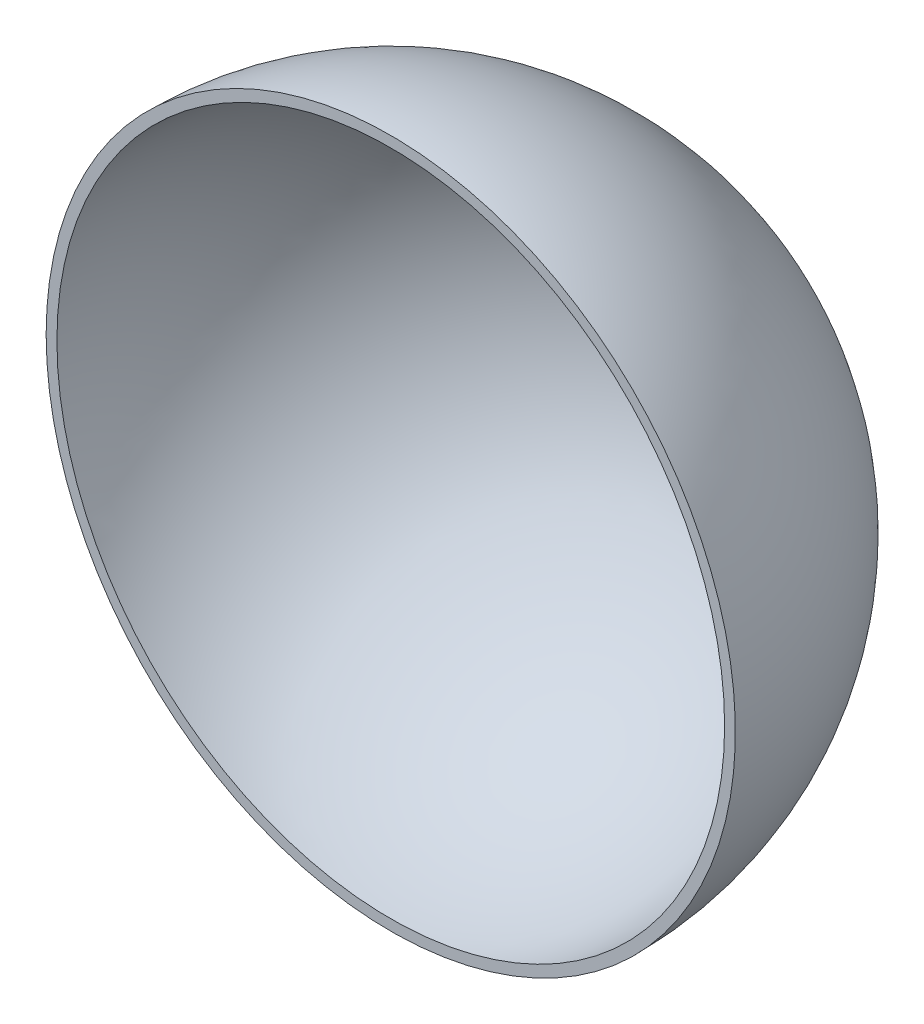
ISO-10303-21;
HEADER;
FILE_DESCRIPTION(('STEP AP214'),'2;1');
FILE_NAME('part.step','',(''),(''),'','','');
FILE_SCHEMA(('AUTOMOTIVE_DESIGN { 1 0 10303 214 1 1 1 1 }'));
ENDSEC;
DATA;
#1=APPLICATION_CONTEXT('core data for automotive mechanical design processes');
#2=APPLICATION_PROTOCOL_DEFINITION('international standard','automotive_design',2000,#1);
#3=PRODUCT_CONTEXT('',#1,'mechanical');
#4=PRODUCT('Part','Part','',(#3));
#5=PRODUCT_RELATED_PRODUCT_CATEGORY('part','',(#4));
#6=PRODUCT_DEFINITION_FORMATION('','',#4);
#7=PRODUCT_DEFINITION_CONTEXT('part definition',#1,'design');
#8=PRODUCT_DEFINITION('design','',#6,#7);
#9=PRODUCT_DEFINITION_SHAPE('','',#8);
#10=(LENGTH_UNIT() NAMED_UNIT(*) SI_UNIT(.MILLI.,.METRE.));
#11=(NAMED_UNIT(*) PLANE_ANGLE_UNIT() SI_UNIT($,.RADIAN.));
#12=(NAMED_UNIT(*) SI_UNIT($,.STERADIAN.) SOLID_ANGLE_UNIT());
#13=UNCERTAINTY_MEASURE_WITH_UNIT(LENGTH_MEASURE(1.E-05),#10,'distance_accuracy_value','');
#14=(GEOMETRIC_REPRESENTATION_CONTEXT(3) GLOBAL_UNCERTAINTY_ASSIGNED_CONTEXT((#13)) GLOBAL_UNIT_ASSIGNED_CONTEXT((#10,
#11,#12)) REPRESENTATION_CONTEXT('',''));
#15=CARTESIAN_POINT('',(0.,0.,0.));
#16=DIRECTION('',(0.,0.,1.));
#17=DIRECTION('',(1.,0.,0.));
#18=AXIS2_PLACEMENT_3D('',#15,#16,#17);
#19=CARTESIAN_POINT('',(0.,0.,0.));
#20=DIRECTION('',(0.,1.,0.));
#21=DIRECTION('',(-1.,0.,0.));
#22=AXIS2_PLACEMENT_3D('',#19,#20,#21);
#23=SPHERICAL_SURFACE('',#22,320.);
#24=CARTESIAN_POINT('',(0.,0.,0.));
#25=DIRECTION('',(0.,0.,-1.));
#26=DIRECTION('',(-1.,0.,0.));
#27=AXIS2_PLACEMENT_3D('',#24,#25,#26);
#28=SPHERICAL_SURFACE('',#27,320.);
#29=CARTESIAN_POINT('',(0.,0.,0.));
#30=DIRECTION('',(0.,0.,-1.));
#31=DIRECTION('',(-1.,0.,0.));
#32=AXIS2_PLACEMENT_3D('',#29,#30,#31);
#33=CIRCLE('',#32,320.);
#34=CARTESIAN_POINT('',(-320.,0.,-2.23454805685961E-12));
#35=VERTEX_POINT('',#34);
#36=EDGE_CURVE('E45',#35,#35,#33,.T.);
#37=ORIENTED_EDGE('',*,*,#36,.T.);
#38=EDGE_LOOP('',(#37));
#39=FACE_BOUND('',#38,.T.);
#40=ADVANCED_FACE('F37',(#39),#28,.T.);
#41=CARTESIAN_POINT('',(0.,0.,0.));
#42=DIRECTION('',(0.,1.,0.));
#43=DIRECTION('',(1.,0.,0.));
#44=AXIS2_PLACEMENT_3D('',#41,#42,#43);
#45=SPHERICAL_SURFACE('',#44,310.);
#46=CARTESIAN_POINT('',(0.,0.,0.));
#47=DIRECTION('',(0.,0.,1.));
#48=DIRECTION('',(-1.,0.,0.));
#49=AXIS2_PLACEMENT_3D('',#46,#47,#48);
#50=SPHERICAL_SURFACE('',#49,310.);
#51=CARTESIAN_POINT('',(0.,0.,0.));
#52=DIRECTION('',(0.,0.,1.));
#53=DIRECTION('',(-1.,0.,0.));
#54=AXIS2_PLACEMENT_3D('',#51,#52,#53);
#55=CIRCLE('',#54,310.);
#56=CARTESIAN_POINT('',(-310.,0.,-2.16471843008274E-12));
#57=VERTEX_POINT('',#56);
#58=EDGE_CURVE('E10',#57,#57,#55,.T.);
#59=ORIENTED_EDGE('',*,*,#58,.T.);
#60=EDGE_LOOP('',(#59));
#61=FACE_BOUND('',#60,.T.);
#62=ADVANCED_FACE('F39',(#61),#50,.F.);
#63=CARTESIAN_POINT('',(0.,0.,0.));
#64=DIRECTION('',(0.,0.,-1.));
#65=DIRECTION('',(-1.,0.,0.));
#66=AXIS2_PLACEMENT_3D('',#63,#64,#65);
#67=PLANE('',#66);
#68=ORIENTED_EDGE('',*,*,#58,.F.);
#69=EDGE_LOOP('',(#68));
#70=FACE_BOUND('',#69,.T.);
#71=ORIENTED_EDGE('',*,*,#36,.F.);
#72=EDGE_LOOP('',(#71));
#73=FACE_BOUND('',#72,.T.);
#74=ADVANCED_FACE('F53',(#70,#73),#67,.F.);
#75=CLOSED_SHELL('',(#40,#62,#74));
#76=MANIFOLD_SOLID_BREP('B2',#75);
#77=ADVANCED_BREP_SHAPE_REPRESENTATION('',(#18,#76),#14);
#78=SHAPE_DEFINITION_REPRESENTATION(#9,#77);
ENDSEC;
END-ISO-10303-21;
